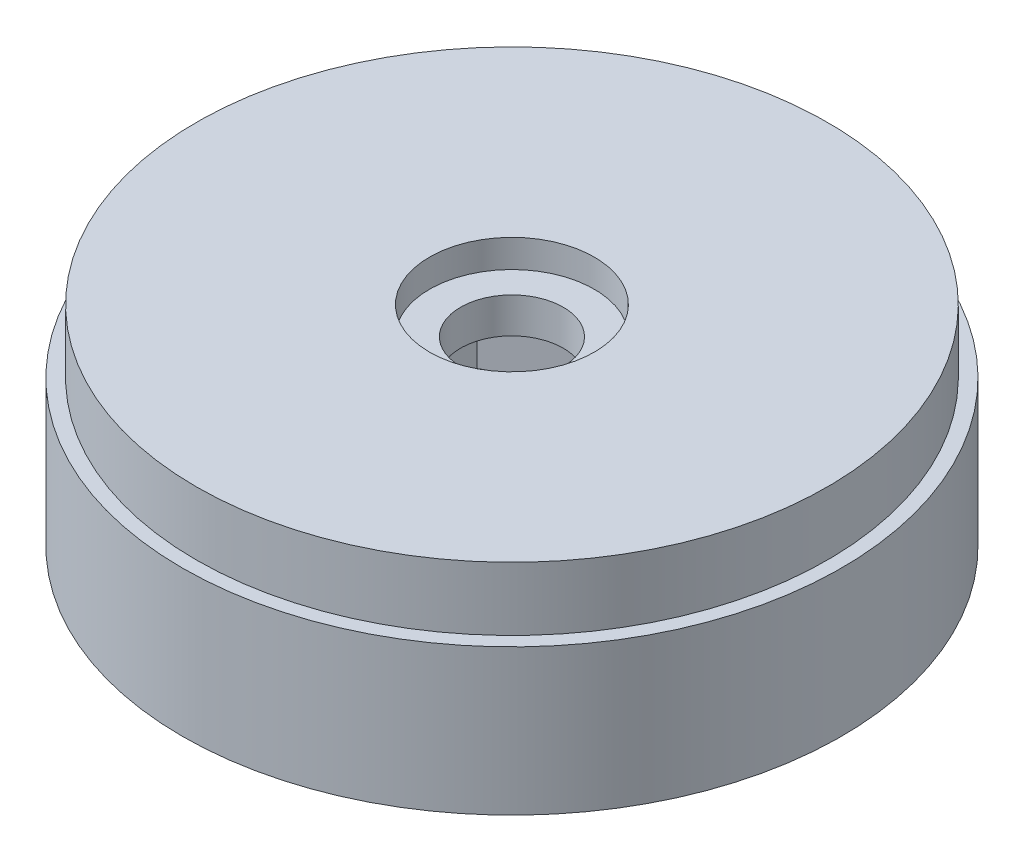
ISO-10303-21;
HEADER;
FILE_DESCRIPTION(('STEP AP214'),'2;1');
FILE_NAME('part.step','',(''),(''),'','','');
FILE_SCHEMA(('AUTOMOTIVE_DESIGN { 1 0 10303 214 1 1 1 1 }'));
ENDSEC;
DATA;
#1=APPLICATION_CONTEXT('core data for automotive mechanical design processes');
#2=APPLICATION_PROTOCOL_DEFINITION('international standard','automotive_design',2000,#1);
#3=PRODUCT_CONTEXT('',#1,'mechanical');
#4=PRODUCT('Part','Part','',(#3));
#5=PRODUCT_RELATED_PRODUCT_CATEGORY('part','',(#4));
#6=PRODUCT_DEFINITION_FORMATION('','',#4);
#7=PRODUCT_DEFINITION_CONTEXT('part definition',#1,'design');
#8=PRODUCT_DEFINITION('design','',#6,#7);
#9=PRODUCT_DEFINITION_SHAPE('','',#8);
#10=(LENGTH_UNIT() NAMED_UNIT(*) SI_UNIT(.MILLI.,.METRE.));
#11=(NAMED_UNIT(*) PLANE_ANGLE_UNIT() SI_UNIT($,.RADIAN.));
#12=(NAMED_UNIT(*) SI_UNIT($,.STERADIAN.) SOLID_ANGLE_UNIT());
#13=UNCERTAINTY_MEASURE_WITH_UNIT(LENGTH_MEASURE(1.E-05),#10,'distance_accuracy_value','');
#14=(GEOMETRIC_REPRESENTATION_CONTEXT(3) GLOBAL_UNCERTAINTY_ASSIGNED_CONTEXT((#13)) GLOBAL_UNIT_ASSIGNED_CONTEXT((#10,
#11,#12)) REPRESENTATION_CONTEXT('',''));
#15=CARTESIAN_POINT('',(0.,0.,0.));
#16=DIRECTION('',(0.,0.,1.));
#17=DIRECTION('',(1.,0.,0.));
#18=AXIS2_PLACEMENT_3D('',#15,#16,#17);
#19=CARTESIAN_POINT('',(0.,16.5,0.));
#20=DIRECTION('',(0.,-1.,0.));
#21=DIRECTION('',(0.,0.,-1.));
#22=AXIS2_PLACEMENT_3D('',#19,#20,#21);
#23=CYLINDRICAL_SURFACE('',#22,4.05);
#24=CARTESIAN_POINT('',(0.,11.5,0.));
#25=DIRECTION('',(0.,1.,0.));
#26=DIRECTION('',(0.,0.,1.));
#27=AXIS2_PLACEMENT_3D('',#24,#25,#26);
#28=CIRCLE('',#27,4.05);
#29=CARTESIAN_POINT('',(0.,11.5,4.05));
#30=VERTEX_POINT('',#29);
#31=EDGE_CURVE('E107',#30,#30,#28,.T.);
#32=ORIENTED_EDGE('',*,*,#31,.F.);
#33=EDGE_LOOP('',(#32));
#34=FACE_BOUND('',#33,.T.);
#35=CARTESIAN_POINT('',(0.,14.3,0.));
#36=DIRECTION('',(0.,1.,0.));
#37=DIRECTION('',(0.,0.,1.));
#38=AXIS2_PLACEMENT_3D('',#35,#36,#37);
#39=CIRCLE('',#38,4.05);
#40=CARTESIAN_POINT('',(0.,14.3,4.05));
#41=VERTEX_POINT('',#40);
#42=EDGE_CURVE('E42',#41,#41,#39,.T.);
#43=ORIENTED_EDGE('',*,*,#42,.T.);
#44=EDGE_LOOP('',(#43));
#45=FACE_BOUND('',#44,.T.);
#46=ADVANCED_FACE('F38',(#34,#45),#23,.F.);
#47=CARTESIAN_POINT('',(6.5,11.5,-3.75277674973257));
#48=DIRECTION('',(-0.5,0.,0.866025403784439));
#49=DIRECTION('',(0.866025403784439,0.,0.5));
#50=AXIS2_PLACEMENT_3D('',#47,#48,#49);
#51=PLANE('',#50);
#52=DIRECTION('',(0.,-1.,0.));
#53=VECTOR('',#52,1.);
#54=CARTESIAN_POINT('',(0.,11.5,-7.50555349946514));
#55=LINE('',#54,#53);
#56=CARTESIAN_POINT('',(0.,11.5,-7.50555349946514));
#57=VERTEX_POINT('',#56);
#58=CARTESIAN_POINT('',(0.,7.,-7.50555349946514));
#59=VERTEX_POINT('',#58);
#60=EDGE_CURVE('E105',#57,#59,#55,.T.);
#61=ORIENTED_EDGE('',*,*,#60,.T.);
#62=DIRECTION('',(0.866025403784439,0.,0.5));
#63=VECTOR('',#62,1.);
#64=CARTESIAN_POINT('',(6.5,7.,-3.75277674973257));
#65=LINE('',#64,#63);
#66=CARTESIAN_POINT('',(6.5,7.,-3.75277674973257));
#67=VERTEX_POINT('',#66);
#68=EDGE_CURVE('E92',#59,#67,#65,.T.);
#69=ORIENTED_EDGE('',*,*,#68,.T.);
#70=DIRECTION('',(0.,-1.,0.));
#71=VECTOR('',#70,1.);
#72=CARTESIAN_POINT('',(6.5,11.5,-3.75277674973257));
#73=LINE('',#72,#71);
#74=CARTESIAN_POINT('',(6.5,11.5,-3.75277674973257));
#75=VERTEX_POINT('',#74);
#76=EDGE_CURVE('E103',#75,#67,#73,.T.);
#77=ORIENTED_EDGE('',*,*,#76,.F.);
#78=DIRECTION('',(-0.866025403784439,0.,-0.5));
#79=VECTOR('',#78,1.);
#80=CARTESIAN_POINT('',(6.5,11.5,-3.75277674973257));
#81=LINE('',#80,#79);
#82=EDGE_CURVE('E226',#75,#57,#81,.T.);
#83=ORIENTED_EDGE('',*,*,#82,.T.);
#84=EDGE_LOOP('',(#61,#69,#77,#83));
#85=FACE_BOUND('',#84,.T.);
#86=ADVANCED_FACE('F101',(#85),#51,.T.);
#87=CARTESIAN_POINT('',(0.,11.5,-7.50555349946514));
#88=DIRECTION('',(0.5,0.,0.866025403784439));
#89=DIRECTION('',(0.866025403784439,0.,-0.5));
#90=AXIS2_PLACEMENT_3D('',#87,#88,#89);
#91=PLANE('',#90);
#92=DIRECTION('',(0.,-1.,0.));
#93=VECTOR('',#92,1.);
#94=CARTESIAN_POINT('',(-6.5,11.5,-3.75277674973257));
#95=LINE('',#94,#93);
#96=CARTESIAN_POINT('',(-6.5,11.5,-3.75277674973257));
#97=VERTEX_POINT('',#96);
#98=CARTESIAN_POINT('',(-6.5,7.,-3.75277674973257));
#99=VERTEX_POINT('',#98);
#100=EDGE_CURVE('E131',#97,#99,#95,.T.);
#101=ORIENTED_EDGE('',*,*,#100,.T.);
#102=DIRECTION('',(0.866025403784439,0.,-0.5));
#103=VECTOR('',#102,1.);
#104=CARTESIAN_POINT('',(0.,7.,-7.50555349946514));
#105=LINE('',#104,#103);
#106=EDGE_CURVE('E108',#99,#59,#105,.T.);
#107=ORIENTED_EDGE('',*,*,#106,.T.);
#108=ORIENTED_EDGE('',*,*,#60,.F.);
#109=DIRECTION('',(-0.866025403784439,0.,0.5));
#110=VECTOR('',#109,1.);
#111=CARTESIAN_POINT('',(0.,11.5,-7.50555349946514));
#112=LINE('',#111,#110);
#113=EDGE_CURVE('E204',#57,#97,#112,.T.);
#114=ORIENTED_EDGE('',*,*,#113,.T.);
#115=EDGE_LOOP('',(#101,#107,#108,#114));
#116=FACE_BOUND('',#115,.T.);
#117=ADVANCED_FACE('F166',(#116),#91,.T.);
#118=CARTESIAN_POINT('',(-6.5,11.5,-3.75277674973257));
#119=DIRECTION('',(1.,0.,0.));
#120=DIRECTION('',(0.,0.,-1.));
#121=AXIS2_PLACEMENT_3D('',#118,#119,#120);
#122=PLANE('',#121);
#123=DIRECTION('',(0.,-1.,0.));
#124=VECTOR('',#123,1.);
#125=CARTESIAN_POINT('',(-6.5,11.5,3.75277674973257));
#126=LINE('',#125,#124);
#127=CARTESIAN_POINT('',(-6.5,11.5,3.75277674973257));
#128=VERTEX_POINT('',#127);
#129=CARTESIAN_POINT('',(-6.5,7.,3.75277674973257));
#130=VERTEX_POINT('',#129);
#131=EDGE_CURVE('E127',#128,#130,#126,.T.);
#132=ORIENTED_EDGE('',*,*,#131,.T.);
#133=DIRECTION('',(0.,0.,-1.));
#134=VECTOR('',#133,1.);
#135=CARTESIAN_POINT('',(-6.5,7.,-3.75277674973257));
#136=LINE('',#135,#134);
#137=EDGE_CURVE('E208',#130,#99,#136,.T.);
#138=ORIENTED_EDGE('',*,*,#137,.T.);
#139=ORIENTED_EDGE('',*,*,#100,.F.);
#140=DIRECTION('',(0.,0.,1.));
#141=VECTOR('',#140,1.);
#142=CARTESIAN_POINT('',(-6.5,11.5,-3.75277674973257));
#143=LINE('',#142,#141);
#144=EDGE_CURVE('E206',#97,#128,#143,.T.);
#145=ORIENTED_EDGE('',*,*,#144,.T.);
#146=EDGE_LOOP('',(#132,#138,#139,#145));
#147=FACE_BOUND('',#146,.T.);
#148=ADVANCED_FACE('F193',(#147),#122,.T.);
#149=CARTESIAN_POINT('',(-6.5,11.5,3.75277674973257));
#150=DIRECTION('',(0.5,0.,-0.866025403784439));
#151=DIRECTION('',(-0.866025403784439,0.,-0.5));
#152=AXIS2_PLACEMENT_3D('',#149,#150,#151);
#153=PLANE('',#152);
#154=DIRECTION('',(0.,-1.,0.));
#155=VECTOR('',#154,1.);
#156=CARTESIAN_POINT('',(0.,11.5,7.50555349946514));
#157=LINE('',#156,#155);
#158=CARTESIAN_POINT('',(0.,11.5,7.50555349946514));
#159=VERTEX_POINT('',#158);
#160=CARTESIAN_POINT('',(0.,7.,7.50555349946514));
#161=VERTEX_POINT('',#160);
#162=EDGE_CURVE('E118',#159,#161,#157,.T.);
#163=ORIENTED_EDGE('',*,*,#162,.T.);
#164=DIRECTION('',(-0.866025403784439,0.,-0.5));
#165=VECTOR('',#164,1.);
#166=CARTESIAN_POINT('',(-6.5,7.,3.75277674973257));
#167=LINE('',#166,#165);
#168=EDGE_CURVE('E211',#161,#130,#167,.T.);
#169=ORIENTED_EDGE('',*,*,#168,.T.);
#170=ORIENTED_EDGE('',*,*,#131,.F.);
#171=DIRECTION('',(0.866025403784439,0.,0.5));
#172=VECTOR('',#171,1.);
#173=CARTESIAN_POINT('',(-6.5,11.5,3.75277674973257));
#174=LINE('',#173,#172);
#175=EDGE_CURVE('E62',#128,#159,#174,.T.);
#176=ORIENTED_EDGE('',*,*,#175,.T.);
#177=EDGE_LOOP('',(#163,#169,#170,#176));
#178=FACE_BOUND('',#177,.T.);
#179=ADVANCED_FACE('F189',(#178),#153,.T.);
#180=CARTESIAN_POINT('',(0.,11.5,7.50555349946514));
#181=DIRECTION('',(-0.5,0.,-0.866025403784439));
#182=DIRECTION('',(-0.866025403784439,0.,0.5));
#183=AXIS2_PLACEMENT_3D('',#180,#181,#182);
#184=PLANE('',#183);
#185=DIRECTION('',(0.,-1.,0.));
#186=VECTOR('',#185,1.);
#187=CARTESIAN_POINT('',(6.5,11.5,3.75277674973257));
#188=LINE('',#187,#186);
#189=CARTESIAN_POINT('',(6.5,11.5,3.75277674973257));
#190=VERTEX_POINT('',#189);
#191=CARTESIAN_POINT('',(6.5,7.,3.75277674973257));
#192=VERTEX_POINT('',#191);
#193=EDGE_CURVE('E114',#190,#192,#188,.T.);
#194=ORIENTED_EDGE('',*,*,#193,.T.);
#195=DIRECTION('',(-0.866025403784439,0.,0.5));
#196=VECTOR('',#195,1.);
#197=CARTESIAN_POINT('',(0.,7.,7.50555349946514));
#198=LINE('',#197,#196);
#199=EDGE_CURVE('E55',#192,#161,#198,.T.);
#200=ORIENTED_EDGE('',*,*,#199,.T.);
#201=ORIENTED_EDGE('',*,*,#162,.F.);
#202=DIRECTION('',(0.866025403784439,0.,-0.5));
#203=VECTOR('',#202,1.);
#204=CARTESIAN_POINT('',(0.,11.5,7.50555349946514));
#205=LINE('',#204,#203);
#206=EDGE_CURVE('E120',#159,#190,#205,.T.);
#207=ORIENTED_EDGE('',*,*,#206,.T.);
#208=EDGE_LOOP('',(#194,#200,#201,#207));
#209=FACE_BOUND('',#208,.T.);
#210=ADVANCED_FACE('F186',(#209),#184,.T.);
#211=CARTESIAN_POINT('',(6.5,11.5,3.75277674973257));
#212=DIRECTION('',(-1.,0.,0.));
#213=DIRECTION('',(0.,0.,1.));
#214=AXIS2_PLACEMENT_3D('',#211,#212,#213);
#215=PLANE('',#214);
#216=ORIENTED_EDGE('',*,*,#76,.T.);
#217=DIRECTION('',(0.,0.,1.));
#218=VECTOR('',#217,1.);
#219=CARTESIAN_POINT('',(6.5,7.,3.75277674973257));
#220=LINE('',#219,#218);
#221=EDGE_CURVE('E11',#67,#192,#220,.T.);
#222=ORIENTED_EDGE('',*,*,#221,.T.);
#223=ORIENTED_EDGE('',*,*,#193,.F.);
#224=DIRECTION('',(0.,0.,-1.));
#225=VECTOR('',#224,1.);
#226=CARTESIAN_POINT('',(6.5,11.5,3.75277674973257));
#227=LINE('',#226,#225);
#228=EDGE_CURVE('E112',#190,#75,#227,.T.);
#229=ORIENTED_EDGE('',*,*,#228,.T.);
#230=EDGE_LOOP('',(#216,#222,#223,#229));
#231=FACE_BOUND('',#230,.T.);
#232=ADVANCED_FACE('F111',(#231),#215,.T.);
#233=CARTESIAN_POINT('',(0.,11.5,0.));
#234=DIRECTION('',(0.,1.,0.));
#235=DIRECTION('',(0.,0.,1.));
#236=AXIS2_PLACEMENT_3D('',#233,#234,#235);
#237=PLANE('',#236);
#238=CARTESIAN_POINT('',(0.,11.5,0.));
#239=DIRECTION('',(0.,1.,0.));
#240=DIRECTION('',(0.,0.,1.));
#241=AXIS2_PLACEMENT_3D('',#238,#239,#240);
#242=CIRCLE('',#241,24.9);
#243=CARTESIAN_POINT('',(0.,11.5,24.9));
#244=VERTEX_POINT('',#243);
#245=EDGE_CURVE('E48',#244,#244,#242,.T.);
#246=ORIENTED_EDGE('',*,*,#245,.F.);
#247=EDGE_LOOP('',(#246));
#248=FACE_BOUND('',#247,.T.);
#249=CARTESIAN_POINT('',(0.,11.5,0.));
#250=DIRECTION('',(0.,1.,0.));
#251=DIRECTION('',(0.,0.,1.));
#252=AXIS2_PLACEMENT_3D('',#249,#250,#251);
#253=CIRCLE('',#252,26.);
#254=CARTESIAN_POINT('',(0.,11.5,26.));
#255=VERTEX_POINT('',#254);
#256=EDGE_CURVE('E138',#255,#255,#253,.T.);
#257=ORIENTED_EDGE('',*,*,#256,.T.);
#258=EDGE_LOOP('',(#257));
#259=FACE_BOUND('',#258,.T.);
#260=ADVANCED_FACE('F149',(#248,#259),#237,.T.);
#261=CARTESIAN_POINT('',(0.,0.,0.));
#262=DIRECTION('',(0.,1.,0.));
#263=DIRECTION('',(0.,0.,1.));
#264=AXIS2_PLACEMENT_3D('',#261,#262,#263);
#265=PLANE('',#264);
#266=CARTESIAN_POINT('',(0.,0.,0.));
#267=DIRECTION('',(0.,-1.,0.));
#268=DIRECTION('',(0.,0.,-1.));
#269=AXIS2_PLACEMENT_3D('',#266,#267,#268);
#270=CIRCLE('',#269,8.);
#271=CARTESIAN_POINT('',(0.,0.,-8.));
#272=VERTEX_POINT('',#271);
#273=EDGE_CURVE('E245',#272,#272,#270,.T.);
#274=ORIENTED_EDGE('',*,*,#273,.F.);
#275=EDGE_LOOP('',(#274));
#276=FACE_BOUND('',#275,.T.);
#277=CARTESIAN_POINT('',(0.,0.,0.));
#278=DIRECTION('',(0.,1.,0.));
#279=DIRECTION('',(0.,0.,1.));
#280=AXIS2_PLACEMENT_3D('',#277,#278,#279);
#281=CIRCLE('',#280,26.);
#282=CARTESIAN_POINT('',(0.,0.,26.));
#283=VERTEX_POINT('',#282);
#284=EDGE_CURVE('E137',#283,#283,#281,.T.);
#285=ORIENTED_EDGE('',*,*,#284,.F.);
#286=EDGE_LOOP('',(#285));
#287=FACE_BOUND('',#286,.T.);
#288=ADVANCED_FACE('F147',(#276,#287),#265,.F.);
#289=CARTESIAN_POINT('',(0.,11.5,0.));
#290=DIRECTION('',(0.,-1.,0.));
#291=DIRECTION('',(0.,0.,-1.));
#292=AXIS2_PLACEMENT_3D('',#289,#290,#291);
#293=CYLINDRICAL_SURFACE('',#292,26.);
#294=ORIENTED_EDGE('',*,*,#256,.F.);
#295=EDGE_LOOP('',(#294));
#296=FACE_BOUND('',#295,.T.);
#297=ORIENTED_EDGE('',*,*,#284,.T.);
#298=EDGE_LOOP('',(#297));
#299=FACE_BOUND('',#298,.T.);
#300=ADVANCED_FACE('F40',(#296,#299),#293,.T.);
#301=CARTESIAN_POINT('',(0.,16.5,0.));
#302=DIRECTION('',(0.,1.,0.));
#303=DIRECTION('',(0.,0.,1.));
#304=AXIS2_PLACEMENT_3D('',#301,#302,#303);
#305=PLANE('',#304);
#306=CARTESIAN_POINT('',(0.,16.5,0.));
#307=DIRECTION('',(0.,1.,0.));
#308=DIRECTION('',(0.,0.,1.));
#309=AXIS2_PLACEMENT_3D('',#306,#307,#308);
#310=CIRCLE('',#309,6.5);
#311=CARTESIAN_POINT('',(0.,16.5,6.5));
#312=VERTEX_POINT('',#311);
#313=EDGE_CURVE('E251',#312,#312,#310,.T.);
#314=ORIENTED_EDGE('',*,*,#313,.F.);
#315=EDGE_LOOP('',(#314));
#316=FACE_BOUND('',#315,.T.);
#317=CARTESIAN_POINT('',(0.,16.5,0.));
#318=DIRECTION('',(0.,1.,0.));
#319=DIRECTION('',(0.,0.,1.));
#320=AXIS2_PLACEMENT_3D('',#317,#318,#319);
#321=CIRCLE('',#320,24.9);
#322=CARTESIAN_POINT('',(0.,16.5,24.9));
#323=VERTEX_POINT('',#322);
#324=EDGE_CURVE('E222',#323,#323,#321,.T.);
#325=ORIENTED_EDGE('',*,*,#324,.T.);
#326=EDGE_LOOP('',(#325));
#327=FACE_BOUND('',#326,.T.);
#328=ADVANCED_FACE('F155',(#316,#327),#305,.T.);
#329=CARTESIAN_POINT('',(0.,11.5,0.));
#330=DIRECTION('',(0.,1.,0.));
#331=DIRECTION('',(0.,0.,1.));
#332=AXIS2_PLACEMENT_3D('',#329,#330,#331);
#333=PLANE('',#332);
#334=ORIENTED_EDGE('',*,*,#113,.F.);
#335=ORIENTED_EDGE('',*,*,#82,.F.);
#336=ORIENTED_EDGE('',*,*,#228,.F.);
#337=ORIENTED_EDGE('',*,*,#206,.F.);
#338=ORIENTED_EDGE('',*,*,#175,.F.);
#339=ORIENTED_EDGE('',*,*,#144,.F.);
#340=EDGE_LOOP('',(#334,#335,#336,#337,#338,#339));
#341=FACE_BOUND('',#340,.T.);
#342=ORIENTED_EDGE('',*,*,#31,.T.);
#343=EDGE_LOOP('',(#342));
#344=FACE_BOUND('',#343,.T.);
#345=ADVANCED_FACE('F176',(#341,#344),#333,.F.);
#346=CARTESIAN_POINT('',(0.,16.5,0.));
#347=DIRECTION('',(0.,-1.,0.));
#348=DIRECTION('',(0.,0.,-1.));
#349=AXIS2_PLACEMENT_3D('',#346,#347,#348);
#350=CYLINDRICAL_SURFACE('',#349,24.9);
#351=ORIENTED_EDGE('',*,*,#324,.F.);
#352=EDGE_LOOP('',(#351));
#353=FACE_BOUND('',#352,.T.);
#354=ORIENTED_EDGE('',*,*,#245,.T.);
#355=EDGE_LOOP('',(#354));
#356=FACE_BOUND('',#355,.T.);
#357=ADVANCED_FACE('F180',(#353,#356),#350,.T.);
#358=CARTESIAN_POINT('',(0.,7.,0.));
#359=DIRECTION('',(0.,-1.,0.));
#360=DIRECTION('',(0.,0.,-1.));
#361=AXIS2_PLACEMENT_3D('',#358,#359,#360);
#362=CYLINDRICAL_SURFACE('',#361,8.);
#363=CARTESIAN_POINT('',(0.,7.,0.));
#364=DIRECTION('',(0.,-1.,0.));
#365=DIRECTION('',(0.,0.,-1.));
#366=AXIS2_PLACEMENT_3D('',#363,#364,#365);
#367=CIRCLE('',#366,8.);
#368=CARTESIAN_POINT('',(0.,7.,-8.));
#369=VERTEX_POINT('',#368);
#370=EDGE_CURVE('E242',#369,#369,#367,.T.);
#371=ORIENTED_EDGE('',*,*,#370,.F.);
#372=EDGE_LOOP('',(#371));
#373=FACE_BOUND('',#372,.T.);
#374=ORIENTED_EDGE('',*,*,#273,.T.);
#375=EDGE_LOOP('',(#374));
#376=FACE_BOUND('',#375,.T.);
#377=ADVANCED_FACE('F172',(#373,#376),#362,.F.);
#378=CARTESIAN_POINT('',(0.,7.,0.));
#379=DIRECTION('',(0.,-1.,0.));
#380=DIRECTION('',(0.,0.,-1.));
#381=AXIS2_PLACEMENT_3D('',#378,#379,#380);
#382=PLANE('',#381);
#383=ORIENTED_EDGE('',*,*,#106,.F.);
#384=ORIENTED_EDGE('',*,*,#137,.F.);
#385=ORIENTED_EDGE('',*,*,#168,.F.);
#386=ORIENTED_EDGE('',*,*,#199,.F.);
#387=ORIENTED_EDGE('',*,*,#221,.F.);
#388=ORIENTED_EDGE('',*,*,#68,.F.);
#389=EDGE_LOOP('',(#383,#384,#385,#386,#387,#388));
#390=FACE_BOUND('',#389,.T.);
#391=ORIENTED_EDGE('',*,*,#370,.T.);
#392=EDGE_LOOP('',(#391));
#393=FACE_BOUND('',#392,.T.);
#394=ADVANCED_FACE('F90',(#390,#393),#382,.T.);
#395=CARTESIAN_POINT('',(0.,14.3,0.));
#396=DIRECTION('',(0.,1.,0.));
#397=DIRECTION('',(0.,0.,1.));
#398=AXIS2_PLACEMENT_3D('',#395,#396,#397);
#399=CYLINDRICAL_SURFACE('',#398,6.5);
#400=CARTESIAN_POINT('',(0.,14.3,0.));
#401=DIRECTION('',(0.,1.,0.));
#402=DIRECTION('',(0.,0.,1.));
#403=AXIS2_PLACEMENT_3D('',#400,#401,#402);
#404=CIRCLE('',#403,6.5);
#405=CARTESIAN_POINT('',(0.,14.3,6.5));
#406=VERTEX_POINT('',#405);
#407=EDGE_CURVE('E255',#406,#406,#404,.T.);
#408=ORIENTED_EDGE('',*,*,#407,.F.);
#409=EDGE_LOOP('',(#408));
#410=FACE_BOUND('',#409,.T.);
#411=ORIENTED_EDGE('',*,*,#313,.T.);
#412=EDGE_LOOP('',(#411));
#413=FACE_BOUND('',#412,.T.);
#414=ADVANCED_FACE('F266',(#410,#413),#399,.F.);
#415=CARTESIAN_POINT('',(0.,14.3,0.));
#416=DIRECTION('',(0.,1.,0.));
#417=DIRECTION('',(0.,0.,1.));
#418=AXIS2_PLACEMENT_3D('',#415,#416,#417);
#419=PLANE('',#418);
#420=ORIENTED_EDGE('',*,*,#42,.F.);
#421=EDGE_LOOP('',(#420));
#422=FACE_BOUND('',#421,.T.);
#423=ORIENTED_EDGE('',*,*,#407,.T.);
#424=EDGE_LOOP('',(#423));
#425=FACE_BOUND('',#424,.T.);
#426=ADVANCED_FACE('F264',(#422,#425),#419,.T.);
#427=CLOSED_SHELL('',(#46,#86,#117,#148,#179,#210,#232,#260,#288,#300,#328,#345,#357,#377,#394,
#414,#426));
#428=MANIFOLD_SOLID_BREP('B2',#427);
#429=ADVANCED_BREP_SHAPE_REPRESENTATION('',(#18,#428),#14);
#430=SHAPE_DEFINITION_REPRESENTATION(#9,#429);
ENDSEC;
END-ISO-10303-21;
